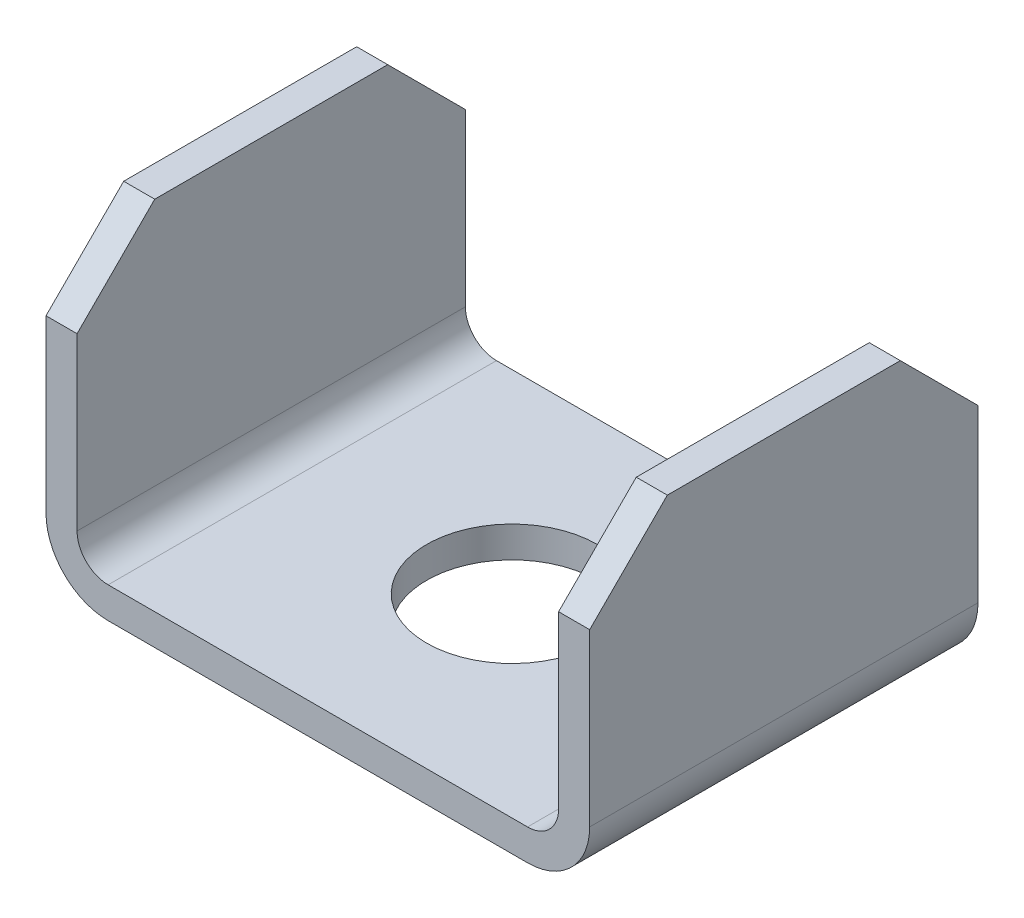
ISO-10303-21;
HEADER;
FILE_DESCRIPTION(('STEP AP214'),'2;1');
FILE_NAME('part.step','',(''),(''),'','','');
FILE_SCHEMA(('AUTOMOTIVE_DESIGN { 1 0 10303 214 1 1 1 1 }'));
ENDSEC;
DATA;
#1=APPLICATION_CONTEXT('core data for automotive mechanical design processes');
#2=APPLICATION_PROTOCOL_DEFINITION('international standard','automotive_design',2000,#1);
#3=PRODUCT_CONTEXT('',#1,'mechanical');
#4=PRODUCT('Part','Part','',(#3));
#5=PRODUCT_RELATED_PRODUCT_CATEGORY('part','',(#4));
#6=PRODUCT_DEFINITION_FORMATION('','',#4);
#7=PRODUCT_DEFINITION_CONTEXT('part definition',#1,'design');
#8=PRODUCT_DEFINITION('design','',#6,#7);
#9=PRODUCT_DEFINITION_SHAPE('','',#8);
#10=(LENGTH_UNIT() NAMED_UNIT(*) SI_UNIT(.MILLI.,.METRE.));
#11=(NAMED_UNIT(*) PLANE_ANGLE_UNIT() SI_UNIT($,.RADIAN.));
#12=(NAMED_UNIT(*) SI_UNIT($,.STERADIAN.) SOLID_ANGLE_UNIT());
#13=UNCERTAINTY_MEASURE_WITH_UNIT(LENGTH_MEASURE(1.E-05),#10,'distance_accuracy_value','');
#14=(GEOMETRIC_REPRESENTATION_CONTEXT(3) GLOBAL_UNCERTAINTY_ASSIGNED_CONTEXT((#13)) GLOBAL_UNIT_ASSIGNED_CONTEXT((#10,
#11,#12)) REPRESENTATION_CONTEXT('',''));
#15=CARTESIAN_POINT('',(0.,0.,0.));
#16=DIRECTION('',(0.,0.,1.));
#17=DIRECTION('',(1.,0.,0.));
#18=AXIS2_PLACEMENT_3D('',#15,#16,#17);
#19=CARTESIAN_POINT('',(-35.,20.,25.));
#20=DIRECTION('',(0.,-1.,0.));
#21=DIRECTION('',(0.,0.,-1.));
#22=AXIS2_PLACEMENT_3D('',#19,#20,#21);
#23=PLANE('',#22);
#24=DIRECTION('',(0.,0.,-1.));
#25=VECTOR('',#24,1.);
#26=CARTESIAN_POINT('',(31.,20.,25.));
#27=LINE('',#26,#25);
#28=CARTESIAN_POINT('',(31.,20.,14.9999999999999));
#29=VERTEX_POINT('',#28);
#30=CARTESIAN_POINT('',(31.,20.,-15.));
#31=VERTEX_POINT('',#30);
#32=EDGE_CURVE('E166',#29,#31,#27,.T.);
#33=ORIENTED_EDGE('',*,*,#32,.F.);
#34=DIRECTION('',(1.,0.,0.));
#35=VECTOR('',#34,1.);
#36=CARTESIAN_POINT('',(35.,20.,14.9999999999999));
#37=LINE('',#36,#35);
#38=CARTESIAN_POINT('',(35.,20.,14.9999999999999));
#39=VERTEX_POINT('',#38);
#40=EDGE_CURVE('E258',#29,#39,#37,.T.);
#41=ORIENTED_EDGE('',*,*,#40,.T.);
#42=DIRECTION('',(0.,0.,-1.));
#43=VECTOR('',#42,1.);
#44=CARTESIAN_POINT('',(35.,20.,25.));
#45=LINE('',#44,#43);
#46=CARTESIAN_POINT('',(35.,20.,-15.));
#47=VERTEX_POINT('',#46);
#48=EDGE_CURVE('E223',#39,#47,#45,.T.);
#49=ORIENTED_EDGE('',*,*,#48,.T.);
#50=DIRECTION('',(-1.,0.,0.));
#51=VECTOR('',#50,1.);
#52=CARTESIAN_POINT('',(-35.,20.,-15.));
#53=LINE('',#52,#51);
#54=EDGE_CURVE('E255',#47,#31,#53,.T.);
#55=ORIENTED_EDGE('',*,*,#54,.T.);
#56=EDGE_LOOP('',(#33,#41,#49,#55));
#57=FACE_BOUND('',#56,.T.);
#58=ADVANCED_FACE('F41',(#57),#23,.F.);
#59=CARTESIAN_POINT('',(35.,20.,25.));
#60=DIRECTION('',(-1.,0.,0.));
#61=DIRECTION('',(0.,0.,1.));
#62=AXIS2_PLACEMENT_3D('',#59,#60,#61);
#63=PLANE('',#62);
#64=ORIENTED_EDGE('',*,*,#48,.F.);
#65=DIRECTION('',(0.,-0.707106781186547,0.707106781186549));
#66=VECTOR('',#65,1.);
#67=CARTESIAN_POINT('',(35.,9.99999999999998,25.));
#68=LINE('',#67,#66);
#69=CARTESIAN_POINT('',(35.,9.99999999999998,25.));
#70=VERTEX_POINT('',#69);
#71=EDGE_CURVE('E262',#39,#70,#68,.T.);
#72=ORIENTED_EDGE('',*,*,#71,.T.);
#73=DIRECTION('',(0.,1.,0.));
#74=VECTOR('',#73,1.);
#75=CARTESIAN_POINT('',(35.,20.,25.));
#76=LINE('',#75,#74);
#77=CARTESIAN_POINT('',(35.,-12.,25.));
#78=VERTEX_POINT('',#77);
#79=EDGE_CURVE('E204',#78,#70,#76,.T.);
#80=ORIENTED_EDGE('',*,*,#79,.F.);
#81=DIRECTION('',(0.,0.,-1.));
#82=VECTOR('',#81,1.);
#83=CARTESIAN_POINT('',(35.,-12.,25.));
#84=LINE('',#83,#82);
#85=CARTESIAN_POINT('',(35.,-12.,-25.));
#86=VERTEX_POINT('',#85);
#87=EDGE_CURVE('E226',#78,#86,#84,.T.);
#88=ORIENTED_EDGE('',*,*,#87,.T.);
#89=DIRECTION('',(0.,1.,0.));
#90=VECTOR('',#89,1.);
#91=CARTESIAN_POINT('',(35.,20.,-25.));
#92=LINE('',#91,#90);
#93=CARTESIAN_POINT('',(35.,9.99999999999996,-25.));
#94=VERTEX_POINT('',#93);
#95=EDGE_CURVE('E214',#86,#94,#92,.T.);
#96=ORIENTED_EDGE('',*,*,#95,.T.);
#97=DIRECTION('',(0.,-0.707106781186549,-0.707106781186547));
#98=VECTOR('',#97,1.);
#99=CARTESIAN_POINT('',(35.,20.,-15.));
#100=LINE('',#99,#98);
#101=EDGE_CURVE('E260',#94,#47,#100,.F.);
#102=ORIENTED_EDGE('',*,*,#101,.T.);
#103=EDGE_LOOP('',(#64,#72,#80,#88,#96,#102));
#104=FACE_BOUND('',#103,.T.);
#105=ADVANCED_FACE('F280',(#104),#63,.F.);
#106=DIRECTION('',(0.,0.,-1.));
#107=VECTOR('',#106,1.);
#108=CARTESIAN_POINT('',(-35.,20.,25.));
#109=LINE('',#108,#107);
#110=CARTESIAN_POINT('',(-35.,20.,14.9999999999999));
#111=VERTEX_POINT('',#110);
#112=CARTESIAN_POINT('',(-35.,20.,-15.));
#113=VERTEX_POINT('',#112);
#114=EDGE_CURVE('E213',#111,#113,#109,.T.);
#115=ORIENTED_EDGE('',*,*,#114,.F.);
#116=DIRECTION('',(1.,0.,0.));
#117=VECTOR('',#116,1.);
#118=CARTESIAN_POINT('',(-31.,20.,14.9999999999999));
#119=LINE('',#118,#117);
#120=CARTESIAN_POINT('',(-31.,20.,14.9999999999999));
#121=VERTEX_POINT('',#120);
#122=EDGE_CURVE('E271',#111,#121,#119,.T.);
#123=ORIENTED_EDGE('',*,*,#122,.T.);
#124=DIRECTION('',(0.,0.,-1.));
#125=VECTOR('',#124,1.);
#126=CARTESIAN_POINT('',(-31.,20.,25.));
#127=LINE('',#126,#125);
#128=CARTESIAN_POINT('',(-31.,20.,-15.));
#129=VERTEX_POINT('',#128);
#130=EDGE_CURVE('E193',#121,#129,#127,.T.);
#131=ORIENTED_EDGE('',*,*,#130,.T.);
#132=DIRECTION('',(-1.,0.,0.));
#133=VECTOR('',#132,1.);
#134=CARTESIAN_POINT('',(-35.,20.,-15.));
#135=LINE('',#134,#133);
#136=EDGE_CURVE('E268',#129,#113,#135,.T.);
#137=ORIENTED_EDGE('',*,*,#136,.T.);
#138=EDGE_LOOP('',(#115,#123,#131,#137));
#139=FACE_BOUND('',#138,.T.);
#140=ADVANCED_FACE('F339',(#139),#23,.F.);
#141=CARTESIAN_POINT('',(-35.,20.,25.));
#142=DIRECTION('',(1.,0.,0.));
#143=DIRECTION('',(0.,0.,-1.));
#144=AXIS2_PLACEMENT_3D('',#141,#142,#143);
#145=PLANE('',#144);
#146=DIRECTION('',(0.,-1.,0.));
#147=VECTOR('',#146,1.);
#148=CARTESIAN_POINT('',(-35.,20.,25.));
#149=LINE('',#148,#147);
#150=CARTESIAN_POINT('',(-35.,9.99999999999998,25.));
#151=VERTEX_POINT('',#150);
#152=CARTESIAN_POINT('',(-35.,-12.,25.));
#153=VERTEX_POINT('',#152);
#154=EDGE_CURVE('E207',#151,#153,#149,.T.);
#155=ORIENTED_EDGE('',*,*,#154,.F.);
#156=DIRECTION('',(0.,0.707106781186547,-0.707106781186549));
#157=VECTOR('',#156,1.);
#158=CARTESIAN_POINT('',(-35.,9.99999999999998,25.));
#159=LINE('',#158,#157);
#160=EDGE_CURVE('E266',#151,#111,#159,.T.);
#161=ORIENTED_EDGE('',*,*,#160,.T.);
#162=ORIENTED_EDGE('',*,*,#114,.T.);
#163=DIRECTION('',(0.,0.707106781186549,0.707106781186547));
#164=VECTOR('',#163,1.);
#165=CARTESIAN_POINT('',(-35.,20.,-15.));
#166=LINE('',#165,#164);
#167=CARTESIAN_POINT('',(-35.,9.99999999999996,-25.));
#168=VERTEX_POINT('',#167);
#169=EDGE_CURVE('E264',#113,#168,#166,.F.);
#170=ORIENTED_EDGE('',*,*,#169,.T.);
#171=DIRECTION('',(0.,-1.,0.));
#172=VECTOR('',#171,1.);
#173=CARTESIAN_POINT('',(-35.,20.,-25.));
#174=LINE('',#173,#172);
#175=CARTESIAN_POINT('',(-35.,-12.,-25.));
#176=VERTEX_POINT('',#175);
#177=EDGE_CURVE('E217',#168,#176,#174,.T.);
#178=ORIENTED_EDGE('',*,*,#177,.T.);
#179=DIRECTION('',(0.,0.,-1.));
#180=VECTOR('',#179,1.);
#181=CARTESIAN_POINT('',(-35.,-12.,25.));
#182=LINE('',#181,#180);
#183=EDGE_CURVE('E243',#176,#153,#182,.F.);
#184=ORIENTED_EDGE('',*,*,#183,.T.);
#185=EDGE_LOOP('',(#155,#161,#162,#170,#178,#184));
#186=FACE_BOUND('',#185,.T.);
#187=ADVANCED_FACE('F342',(#186),#145,.F.);
#188=CARTESIAN_POINT('',(-35.,-20.,25.));
#189=DIRECTION('',(0.,1.,0.));
#190=DIRECTION('',(0.,0.,1.));
#191=AXIS2_PLACEMENT_3D('',#188,#189,#190);
#192=PLANE('',#191);
#193=CARTESIAN_POINT('',(0.,-20.,0.));
#194=DIRECTION('',(0.,1.,0.));
#195=DIRECTION('',(0.,0.,1.));
#196=AXIS2_PLACEMENT_3D('',#193,#194,#195);
#197=CIRCLE('',#196,11.);
#198=CARTESIAN_POINT('',(0.,-20.,11.));
#199=VERTEX_POINT('',#198);
#200=EDGE_CURVE('E175',#199,#199,#197,.F.);
#201=ORIENTED_EDGE('',*,*,#200,.F.);
#202=EDGE_LOOP('',(#201));
#203=FACE_BOUND('',#202,.T.);
#204=DIRECTION('',(1.,0.,0.));
#205=VECTOR('',#204,1.);
#206=CARTESIAN_POINT('',(-35.,-20.,-25.));
#207=LINE('',#206,#205);
#208=CARTESIAN_POINT('',(-27.,-20.,-25.));
#209=VERTEX_POINT('',#208);
#210=CARTESIAN_POINT('',(27.,-20.,-25.));
#211=VERTEX_POINT('',#210);
#212=EDGE_CURVE('E208',#209,#211,#207,.T.);
#213=ORIENTED_EDGE('',*,*,#212,.T.);
#214=DIRECTION('',(0.,0.,-1.));
#215=VECTOR('',#214,1.);
#216=CARTESIAN_POINT('',(27.,-20.,25.));
#217=LINE('',#216,#215);
#218=CARTESIAN_POINT('',(27.,-20.,25.));
#219=VERTEX_POINT('',#218);
#220=EDGE_CURVE('E237',#211,#219,#217,.F.);
#221=ORIENTED_EDGE('',*,*,#220,.T.);
#222=DIRECTION('',(1.,0.,0.));
#223=VECTOR('',#222,1.);
#224=CARTESIAN_POINT('',(-35.,-20.,25.));
#225=LINE('',#224,#223);
#226=CARTESIAN_POINT('',(-27.,-20.,25.));
#227=VERTEX_POINT('',#226);
#228=EDGE_CURVE('E210',#227,#219,#225,.T.);
#229=ORIENTED_EDGE('',*,*,#228,.F.);
#230=DIRECTION('',(0.,0.,-1.));
#231=VECTOR('',#230,1.);
#232=CARTESIAN_POINT('',(-27.,-20.,25.));
#233=LINE('',#232,#231);
#234=EDGE_CURVE('E234',#227,#209,#233,.T.);
#235=ORIENTED_EDGE('',*,*,#234,.T.);
#236=EDGE_LOOP('',(#213,#221,#229,#235));
#237=FACE_BOUND('',#236,.T.);
#238=ADVANCED_FACE('F326',(#203,#237),#192,.F.);
#239=CARTESIAN_POINT('',(0.,0.,25.));
#240=DIRECTION('',(0.,0.,1.));
#241=DIRECTION('',(1.,0.,0.));
#242=AXIS2_PLACEMENT_3D('',#239,#240,#241);
#243=PLANE('',#242);
#244=ORIENTED_EDGE('',*,*,#79,.T.);
#245=DIRECTION('',(-1.,0.,0.));
#246=VECTOR('',#245,1.);
#247=CARTESIAN_POINT('',(31.,9.99999999999998,25.));
#248=LINE('',#247,#246);
#249=CARTESIAN_POINT('',(31.,9.99999999999998,25.));
#250=VERTEX_POINT('',#249);
#251=EDGE_CURVE('E249',#70,#250,#248,.T.);
#252=ORIENTED_EDGE('',*,*,#251,.T.);
#253=DIRECTION('',(0.,1.,0.));
#254=VECTOR('',#253,1.);
#255=CARTESIAN_POINT('',(31.,20.,25.));
#256=LINE('',#255,#254);
#257=CARTESIAN_POINT('',(31.,-12.,25.));
#258=VERTEX_POINT('',#257);
#259=EDGE_CURVE('E190',#258,#250,#256,.T.);
#260=ORIENTED_EDGE('',*,*,#259,.F.);
#261=CARTESIAN_POINT('',(27.,-12.,25.));
#262=DIRECTION('',(0.,0.,1.));
#263=DIRECTION('',(1.,0.,0.));
#264=AXIS2_PLACEMENT_3D('',#261,#262,#263);
#265=CIRCLE('',#264,4.);
#266=CARTESIAN_POINT('',(27.,-16.,25.));
#267=VERTEX_POINT('',#266);
#268=EDGE_CURVE('E161',#267,#258,#265,.T.);
#269=ORIENTED_EDGE('',*,*,#268,.F.);
#270=DIRECTION('',(1.,0.,0.));
#271=VECTOR('',#270,1.);
#272=CARTESIAN_POINT('',(-35.,-16.,25.));
#273=LINE('',#272,#271);
#274=CARTESIAN_POINT('',(-27.,-16.,25.));
#275=VERTEX_POINT('',#274);
#276=EDGE_CURVE('E195',#275,#267,#273,.T.);
#277=ORIENTED_EDGE('',*,*,#276,.F.);
#278=CARTESIAN_POINT('',(-27.,-12.,25.));
#279=DIRECTION('',(0.,0.,1.));
#280=DIRECTION('',(1.,0.,0.));
#281=AXIS2_PLACEMENT_3D('',#278,#279,#280);
#282=CIRCLE('',#281,4.);
#283=CARTESIAN_POINT('',(-31.,-12.,25.));
#284=VERTEX_POINT('',#283);
#285=EDGE_CURVE('E198',#284,#275,#282,.T.);
#286=ORIENTED_EDGE('',*,*,#285,.F.);
#287=DIRECTION('',(0.,-1.,0.));
#288=VECTOR('',#287,1.);
#289=CARTESIAN_POINT('',(-31.,20.,25.));
#290=LINE('',#289,#288);
#291=CARTESIAN_POINT('',(-31.,9.99999999999998,25.));
#292=VERTEX_POINT('',#291);
#293=EDGE_CURVE('E196',#292,#284,#290,.T.);
#294=ORIENTED_EDGE('',*,*,#293,.F.);
#295=DIRECTION('',(-1.,0.,0.));
#296=VECTOR('',#295,1.);
#297=CARTESIAN_POINT('',(-35.,9.99999999999998,25.));
#298=LINE('',#297,#296);
#299=EDGE_CURVE('E246',#292,#151,#298,.T.);
#300=ORIENTED_EDGE('',*,*,#299,.T.);
#301=ORIENTED_EDGE('',*,*,#154,.T.);
#302=CARTESIAN_POINT('',(-27.,-12.,25.));
#303=DIRECTION('',(0.,0.,1.));
#304=DIRECTION('',(1.,0.,0.));
#305=AXIS2_PLACEMENT_3D('',#302,#303,#304);
#306=CIRCLE('',#305,8.);
#307=EDGE_CURVE('E239',#153,#227,#306,.T.);
#308=ORIENTED_EDGE('',*,*,#307,.T.);
#309=ORIENTED_EDGE('',*,*,#228,.T.);
#310=CARTESIAN_POINT('',(27.,-12.,25.));
#311=DIRECTION('',(0.,0.,1.));
#312=DIRECTION('',(1.,0.,0.));
#313=AXIS2_PLACEMENT_3D('',#310,#311,#312);
#314=CIRCLE('',#313,8.);
#315=EDGE_CURVE('E241',#219,#78,#314,.T.);
#316=ORIENTED_EDGE('',*,*,#315,.T.);
#317=EDGE_LOOP('',(#244,#252,#260,#269,#277,#286,#294,#300,#301,#308,#309,#316));
#318=FACE_BOUND('',#317,.T.);
#319=ADVANCED_FACE('F314',(#318),#243,.T.);
#320=CARTESIAN_POINT('',(0.,0.,-25.));
#321=DIRECTION('',(0.,0.,1.));
#322=DIRECTION('',(1.,0.,0.));
#323=AXIS2_PLACEMENT_3D('',#320,#321,#322);
#324=PLANE('',#323);
#325=ORIENTED_EDGE('',*,*,#177,.F.);
#326=DIRECTION('',(1.,0.,0.));
#327=VECTOR('',#326,1.);
#328=CARTESIAN_POINT('',(0.,9.99999999999996,-25.));
#329=LINE('',#328,#327);
#330=CARTESIAN_POINT('',(-31.,9.99999999999996,-25.));
#331=VERTEX_POINT('',#330);
#332=EDGE_CURVE('E11',#168,#331,#329,.T.);
#333=ORIENTED_EDGE('',*,*,#332,.T.);
#334=DIRECTION('',(0.,-1.,0.));
#335=VECTOR('',#334,1.);
#336=CARTESIAN_POINT('',(-31.,20.,-25.));
#337=LINE('',#336,#335);
#338=CARTESIAN_POINT('',(-31.,-12.,-25.));
#339=VERTEX_POINT('',#338);
#340=EDGE_CURVE('E174',#331,#339,#337,.T.);
#341=ORIENTED_EDGE('',*,*,#340,.T.);
#342=CARTESIAN_POINT('',(-27.,-12.,-25.));
#343=DIRECTION('',(0.,0.,1.));
#344=DIRECTION('',(1.,0.,0.));
#345=AXIS2_PLACEMENT_3D('',#342,#343,#344);
#346=CIRCLE('',#345,4.);
#347=CARTESIAN_POINT('',(-27.,-16.,-25.));
#348=VERTEX_POINT('',#347);
#349=EDGE_CURVE('E165',#348,#339,#346,.F.);
#350=ORIENTED_EDGE('',*,*,#349,.F.);
#351=DIRECTION('',(1.,0.,0.));
#352=VECTOR('',#351,1.);
#353=CARTESIAN_POINT('',(-35.,-16.,-25.));
#354=LINE('',#353,#352);
#355=CARTESIAN_POINT('',(27.,-16.,-25.));
#356=VERTEX_POINT('',#355);
#357=EDGE_CURVE('E181',#348,#356,#354,.T.);
#358=ORIENTED_EDGE('',*,*,#357,.T.);
#359=CARTESIAN_POINT('',(27.,-12.,-25.));
#360=DIRECTION('',(0.,0.,1.));
#361=DIRECTION('',(1.,0.,0.));
#362=AXIS2_PLACEMENT_3D('',#359,#360,#361);
#363=CIRCLE('',#362,4.);
#364=CARTESIAN_POINT('',(31.,-12.,-25.));
#365=VERTEX_POINT('',#364);
#366=EDGE_CURVE('E158',#365,#356,#363,.F.);
#367=ORIENTED_EDGE('',*,*,#366,.F.);
#368=DIRECTION('',(0.,1.,0.));
#369=VECTOR('',#368,1.);
#370=CARTESIAN_POINT('',(31.,20.,-25.));
#371=LINE('',#370,#369);
#372=CARTESIAN_POINT('',(31.,9.99999999999996,-25.));
#373=VERTEX_POINT('',#372);
#374=EDGE_CURVE('E169',#365,#373,#371,.T.);
#375=ORIENTED_EDGE('',*,*,#374,.T.);
#376=DIRECTION('',(1.,0.,0.));
#377=VECTOR('',#376,1.);
#378=CARTESIAN_POINT('',(0.,9.99999999999996,-25.));
#379=LINE('',#378,#377);
#380=EDGE_CURVE('E50',#373,#94,#379,.T.);
#381=ORIENTED_EDGE('',*,*,#380,.T.);
#382=ORIENTED_EDGE('',*,*,#95,.F.);
#383=CARTESIAN_POINT('',(27.,-12.,-25.));
#384=DIRECTION('',(0.,0.,1.));
#385=DIRECTION('',(1.,0.,0.));
#386=AXIS2_PLACEMENT_3D('',#383,#384,#385);
#387=CIRCLE('',#386,8.);
#388=EDGE_CURVE('E232',#86,#211,#387,.F.);
#389=ORIENTED_EDGE('',*,*,#388,.T.);
#390=ORIENTED_EDGE('',*,*,#212,.F.);
#391=CARTESIAN_POINT('',(-27.,-12.,-25.));
#392=DIRECTION('',(0.,0.,1.));
#393=DIRECTION('',(1.,0.,0.));
#394=AXIS2_PLACEMENT_3D('',#391,#392,#393);
#395=CIRCLE('',#394,8.);
#396=EDGE_CURVE('E229',#209,#176,#395,.F.);
#397=ORIENTED_EDGE('',*,*,#396,.T.);
#398=EDGE_LOOP('',(#325,#333,#341,#350,#358,#367,#375,#381,#382,#389,#390,#397));
#399=FACE_BOUND('',#398,.T.);
#400=ADVANCED_FACE('F178',(#399),#324,.F.);
#401=CARTESIAN_POINT('',(27.,-12.,25.));
#402=DIRECTION('',(0.,0.,-1.));
#403=DIRECTION('',(-1.,0.,0.));
#404=AXIS2_PLACEMENT_3D('',#401,#402,#403);
#405=CYLINDRICAL_SURFACE('',#404,8.);
#406=ORIENTED_EDGE('',*,*,#315,.F.);
#407=ORIENTED_EDGE('',*,*,#220,.F.);
#408=ORIENTED_EDGE('',*,*,#388,.F.);
#409=ORIENTED_EDGE('',*,*,#87,.F.);
#410=EDGE_LOOP('',(#406,#407,#408,#409));
#411=FACE_BOUND('',#410,.T.);
#412=ADVANCED_FACE('F322',(#411),#405,.T.);
#413=CARTESIAN_POINT('',(-27.,-12.,25.));
#414=DIRECTION('',(0.,0.,-1.));
#415=DIRECTION('',(-1.,0.,0.));
#416=AXIS2_PLACEMENT_3D('',#413,#414,#415);
#417=CYLINDRICAL_SURFACE('',#416,8.);
#418=ORIENTED_EDGE('',*,*,#307,.F.);
#419=ORIENTED_EDGE('',*,*,#183,.F.);
#420=ORIENTED_EDGE('',*,*,#396,.F.);
#421=ORIENTED_EDGE('',*,*,#234,.F.);
#422=EDGE_LOOP('',(#418,#419,#420,#421));
#423=FACE_BOUND('',#422,.T.);
#424=ADVANCED_FACE('F331',(#423),#417,.T.);
#425=CARTESIAN_POINT('',(31.,20.,25.));
#426=DIRECTION('',(-1.,0.,0.));
#427=DIRECTION('',(0.,0.,1.));
#428=AXIS2_PLACEMENT_3D('',#425,#426,#427);
#429=PLANE('',#428);
#430=ORIENTED_EDGE('',*,*,#259,.T.);
#431=DIRECTION('',(0.,0.707106781186547,-0.707106781186549));
#432=VECTOR('',#431,1.);
#433=CARTESIAN_POINT('',(31.,15.,20.));
#434=LINE('',#433,#432);
#435=EDGE_CURVE('E253',#250,#29,#434,.T.);
#436=ORIENTED_EDGE('',*,*,#435,.T.);
#437=ORIENTED_EDGE('',*,*,#32,.T.);
#438=DIRECTION('',(0.,0.707106781186549,0.707106781186547));
#439=VECTOR('',#438,1.);
#440=CARTESIAN_POINT('',(31.,40.,4.99999999999995));
#441=LINE('',#440,#439);
#442=EDGE_CURVE('E172',#31,#373,#441,.F.);
#443=ORIENTED_EDGE('',*,*,#442,.T.);
#444=ORIENTED_EDGE('',*,*,#374,.F.);
#445=DIRECTION('',(0.,0.,1.));
#446=VECTOR('',#445,1.);
#447=CARTESIAN_POINT('',(31.,-12.,25.));
#448=LINE('',#447,#446);
#449=EDGE_CURVE('E154',#258,#365,#448,.F.);
#450=ORIENTED_EDGE('',*,*,#449,.F.);
#451=EDGE_LOOP('',(#430,#436,#437,#443,#444,#450));
#452=FACE_BOUND('',#451,.T.);
#453=ADVANCED_FACE('F170',(#452),#429,.T.);
#454=CARTESIAN_POINT('',(-31.,20.,25.));
#455=DIRECTION('',(1.,0.,0.));
#456=DIRECTION('',(0.,0.,-1.));
#457=AXIS2_PLACEMENT_3D('',#454,#455,#456);
#458=PLANE('',#457);
#459=ORIENTED_EDGE('',*,*,#130,.F.);
#460=DIRECTION('',(0.,-0.707106781186547,0.707106781186549));
#461=VECTOR('',#460,1.);
#462=CARTESIAN_POINT('',(-31.,15.,20.));
#463=LINE('',#462,#461);
#464=EDGE_CURVE('E274',#121,#292,#463,.T.);
#465=ORIENTED_EDGE('',*,*,#464,.T.);
#466=ORIENTED_EDGE('',*,*,#293,.T.);
#467=DIRECTION('',(0.,0.,-1.));
#468=VECTOR('',#467,1.);
#469=CARTESIAN_POINT('',(-31.,-12.,25.));
#470=LINE('',#469,#468);
#471=EDGE_CURVE('E203',#339,#284,#470,.F.);
#472=ORIENTED_EDGE('',*,*,#471,.F.);
#473=ORIENTED_EDGE('',*,*,#340,.F.);
#474=DIRECTION('',(0.,-0.707106781186549,-0.707106781186547));
#475=VECTOR('',#474,1.);
#476=CARTESIAN_POINT('',(-31.,40.,4.99999999999995));
#477=LINE('',#476,#475);
#478=EDGE_CURVE('E62',#331,#129,#477,.F.);
#479=ORIENTED_EDGE('',*,*,#478,.T.);
#480=EDGE_LOOP('',(#459,#465,#466,#472,#473,#479));
#481=FACE_BOUND('',#480,.T.);
#482=ADVANCED_FACE('F304',(#481),#458,.T.);
#483=CARTESIAN_POINT('',(-35.,-16.,25.));
#484=DIRECTION('',(0.,1.,0.));
#485=DIRECTION('',(0.,0.,1.));
#486=AXIS2_PLACEMENT_3D('',#483,#484,#485);
#487=PLANE('',#486);
#488=CARTESIAN_POINT('',(0.,-16.,0.));
#489=DIRECTION('',(0.,1.,0.));
#490=DIRECTION('',(0.,0.,1.));
#491=AXIS2_PLACEMENT_3D('',#488,#489,#490);
#492=CIRCLE('',#491,11.);
#493=CARTESIAN_POINT('',(0.,-16.,11.));
#494=VERTEX_POINT('',#493);
#495=EDGE_CURVE('E294',#494,#494,#492,.T.);
#496=ORIENTED_EDGE('',*,*,#495,.F.);
#497=EDGE_LOOP('',(#496));
#498=FACE_BOUND('',#497,.T.);
#499=ORIENTED_EDGE('',*,*,#357,.F.);
#500=DIRECTION('',(0.,0.,1.));
#501=VECTOR('',#500,1.);
#502=CARTESIAN_POINT('',(-27.,-16.,25.));
#503=LINE('',#502,#501);
#504=EDGE_CURVE('E182',#275,#348,#503,.F.);
#505=ORIENTED_EDGE('',*,*,#504,.F.);
#506=ORIENTED_EDGE('',*,*,#276,.T.);
#507=DIRECTION('',(0.,0.,1.));
#508=VECTOR('',#507,1.);
#509=CARTESIAN_POINT('',(27.,-16.,25.));
#510=LINE('',#509,#508);
#511=EDGE_CURVE('E184',#356,#267,#510,.T.);
#512=ORIENTED_EDGE('',*,*,#511,.F.);
#513=EDGE_LOOP('',(#499,#505,#506,#512));
#514=FACE_BOUND('',#513,.T.);
#515=ADVANCED_FACE('F301',(#498,#514),#487,.T.);
#516=CARTESIAN_POINT('',(27.,-12.,25.));
#517=DIRECTION('',(0.,0.,-1.));
#518=DIRECTION('',(-1.,0.,0.));
#519=AXIS2_PLACEMENT_3D('',#516,#517,#518);
#520=CYLINDRICAL_SURFACE('',#519,4.);
#521=ORIENTED_EDGE('',*,*,#268,.T.);
#522=ORIENTED_EDGE('',*,*,#449,.T.);
#523=ORIENTED_EDGE('',*,*,#366,.T.);
#524=ORIENTED_EDGE('',*,*,#511,.T.);
#525=EDGE_LOOP('',(#521,#522,#523,#524));
#526=FACE_BOUND('',#525,.T.);
#527=ADVANCED_FACE('F156',(#526),#520,.F.);
#528=CARTESIAN_POINT('',(-27.,-12.,25.));
#529=DIRECTION('',(0.,0.,-1.));
#530=DIRECTION('',(-1.,0.,0.));
#531=AXIS2_PLACEMENT_3D('',#528,#529,#530);
#532=CYLINDRICAL_SURFACE('',#531,4.);
#533=ORIENTED_EDGE('',*,*,#285,.T.);
#534=ORIENTED_EDGE('',*,*,#504,.T.);
#535=ORIENTED_EDGE('',*,*,#349,.T.);
#536=ORIENTED_EDGE('',*,*,#471,.T.);
#537=EDGE_LOOP('',(#533,#534,#535,#536));
#538=FACE_BOUND('',#537,.T.);
#539=ADVANCED_FACE('F310',(#538),#532,.F.);
#540=CARTESIAN_POINT('',(0.,9.99999999999998,25.));
#541=DIRECTION('',(0.,0.707106781186549,0.707106781186547));
#542=DIRECTION('',(1.,0.,0.));
#543=AXIS2_PLACEMENT_3D('',#540,#541,#542);
#544=PLANE('',#543);
#545=ORIENTED_EDGE('',*,*,#71,.F.);
#546=ORIENTED_EDGE('',*,*,#40,.F.);
#547=ORIENTED_EDGE('',*,*,#435,.F.);
#548=ORIENTED_EDGE('',*,*,#251,.F.);
#549=EDGE_LOOP('',(#545,#546,#547,#548));
#550=FACE_BOUND('',#549,.T.);
#551=ADVANCED_FACE('F319',(#550),#544,.T.);
#552=CARTESIAN_POINT('',(0.,9.99999999999998,25.));
#553=DIRECTION('',(0.,0.707106781186549,0.707106781186547));
#554=DIRECTION('',(1.,0.,0.));
#555=AXIS2_PLACEMENT_3D('',#552,#553,#554);
#556=PLANE('',#555);
#557=ORIENTED_EDGE('',*,*,#464,.F.);
#558=ORIENTED_EDGE('',*,*,#122,.F.);
#559=ORIENTED_EDGE('',*,*,#160,.F.);
#560=ORIENTED_EDGE('',*,*,#299,.F.);
#561=EDGE_LOOP('',(#557,#558,#559,#560));
#562=FACE_BOUND('',#561,.T.);
#563=ADVANCED_FACE('F345',(#562),#556,.T.);
#564=CARTESIAN_POINT('',(-35.,20.,-15.));
#565=DIRECTION('',(0.,-0.707106781186547,0.707106781186549));
#566=DIRECTION('',(-1.,0.,0.));
#567=AXIS2_PLACEMENT_3D('',#564,#565,#566);
#568=PLANE('',#567);
#569=ORIENTED_EDGE('',*,*,#478,.F.);
#570=ORIENTED_EDGE('',*,*,#332,.F.);
#571=ORIENTED_EDGE('',*,*,#169,.F.);
#572=ORIENTED_EDGE('',*,*,#136,.F.);
#573=EDGE_LOOP('',(#569,#570,#571,#572));
#574=FACE_BOUND('',#573,.T.);
#575=ADVANCED_FACE('F335',(#574),#568,.F.);
#576=CARTESIAN_POINT('',(-35.,20.,-15.));
#577=DIRECTION('',(0.,-0.707106781186547,0.707106781186549));
#578=DIRECTION('',(-1.,0.,0.));
#579=AXIS2_PLACEMENT_3D('',#576,#577,#578);
#580=PLANE('',#579);
#581=ORIENTED_EDGE('',*,*,#101,.F.);
#582=ORIENTED_EDGE('',*,*,#380,.F.);
#583=ORIENTED_EDGE('',*,*,#442,.F.);
#584=ORIENTED_EDGE('',*,*,#54,.F.);
#585=EDGE_LOOP('',(#581,#582,#583,#584));
#586=FACE_BOUND('',#585,.T.);
#587=ADVANCED_FACE('F44',(#586),#580,.F.);
#588=CARTESIAN_POINT('',(0.,-20.001,0.));
#589=DIRECTION('',(0.,1.,0.));
#590=DIRECTION('',(0.,0.,1.));
#591=AXIS2_PLACEMENT_3D('',#588,#589,#590);
#592=CYLINDRICAL_SURFACE('',#591,11.);
#593=ORIENTED_EDGE('',*,*,#495,.T.);
#594=EDGE_LOOP('',(#593));
#595=FACE_BOUND('',#594,.T.);
#596=ORIENTED_EDGE('',*,*,#200,.T.);
#597=EDGE_LOOP('',(#596));
#598=FACE_BOUND('',#597,.T.);
#599=ADVANCED_FACE('F298',(#595,#598),#592,.F.);
#600=CLOSED_SHELL('',(#58,#105,#140,#187,#238,#319,#400,#412,#424,#453,#482,#515,#527,#539,#551,
#563,#575,#587,#599));
#601=MANIFOLD_SOLID_BREP('B2',#600);
#602=ADVANCED_BREP_SHAPE_REPRESENTATION('',(#18,#601),#14);
#603=SHAPE_DEFINITION_REPRESENTATION(#9,#602);
ENDSEC;
END-ISO-10303-21;
